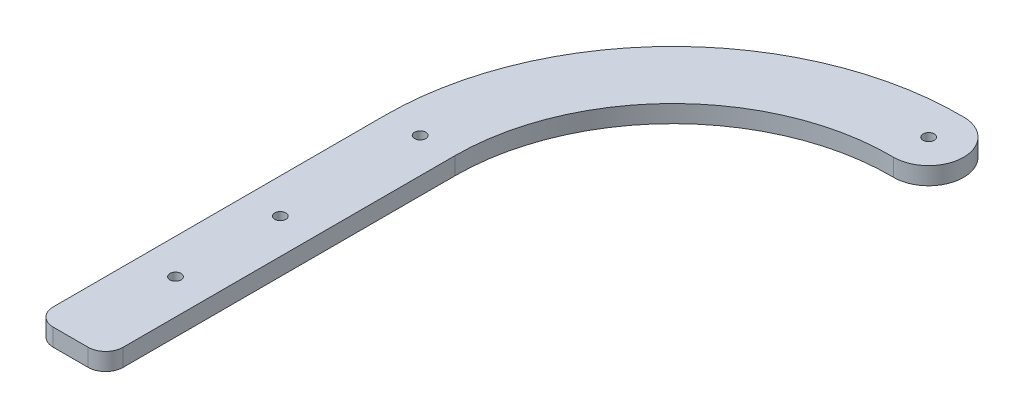
ISO-10303-21;
HEADER;
FILE_DESCRIPTION(('STEP AP214'),'2;1');
FILE_NAME('part.step','',(''),(''),'','','');
FILE_SCHEMA(('AUTOMOTIVE_DESIGN { 1 0 10303 214 1 1 1 1 }'));
ENDSEC;
DATA;
#1=APPLICATION_CONTEXT('core data for automotive mechanical design processes');
#2=APPLICATION_PROTOCOL_DEFINITION('international standard','automotive_design',2000,#1);
#3=PRODUCT_CONTEXT('',#1,'mechanical');
#4=PRODUCT('Part','Part','',(#3));
#5=PRODUCT_RELATED_PRODUCT_CATEGORY('part','',(#4));
#6=PRODUCT_DEFINITION_FORMATION('','',#4);
#7=PRODUCT_DEFINITION_CONTEXT('part definition',#1,'design');
#8=PRODUCT_DEFINITION('design','',#6,#7);
#9=PRODUCT_DEFINITION_SHAPE('','',#8);
#10=(LENGTH_UNIT() NAMED_UNIT(*) SI_UNIT(.MILLI.,.METRE.));
#11=(NAMED_UNIT(*) PLANE_ANGLE_UNIT() SI_UNIT($,.RADIAN.));
#12=(NAMED_UNIT(*) SI_UNIT($,.STERADIAN.) SOLID_ANGLE_UNIT());
#13=UNCERTAINTY_MEASURE_WITH_UNIT(LENGTH_MEASURE(1.E-05),#10,'distance_accuracy_value','');
#14=(GEOMETRIC_REPRESENTATION_CONTEXT(3) GLOBAL_UNCERTAINTY_ASSIGNED_CONTEXT((#13)) GLOBAL_UNIT_ASSIGNED_CONTEXT((#10,
#11,#12)) REPRESENTATION_CONTEXT('',''));
#15=CARTESIAN_POINT('',(0.,0.,0.));
#16=DIRECTION('',(0.,0.,1.));
#17=DIRECTION('',(1.,0.,0.));
#18=AXIS2_PLACEMENT_3D('',#15,#16,#17);
#19=CARTESIAN_POINT('',(82.3373430789616,5.,-100.));
#20=DIRECTION('',(0.,-1.,0.));
#21=DIRECTION('',(0.,0.,-1.));
#22=AXIS2_PLACEMENT_3D('',#19,#20,#21);
#23=CYLINDRICAL_SURFACE('',#22,82.3373430789616);
#24=CARTESIAN_POINT('',(82.3373430789616,0.,-100.));
#25=DIRECTION('',(0.,1.,0.));
#26=DIRECTION('',(0.,0.,-1.));
#27=AXIS2_PLACEMENT_3D('',#24,#25,#26);
#28=CIRCLE('',#27,82.3373430789616);
#29=CARTESIAN_POINT('',(83.2933897880461,0.,-182.33179240119));
#30=VERTEX_POINT('',#29);
#31=CARTESIAN_POINT('',(0.,0.,-100.));
#32=VERTEX_POINT('',#31);
#33=EDGE_CURVE('E116',#30,#32,#28,.T.);
#34=ORIENTED_EDGE('',*,*,#33,.T.);
#35=DIRECTION('',(0.,-1.,0.));
#36=VECTOR('',#35,1.);
#37=CARTESIAN_POINT('',(0.,5.,-100.));
#38=LINE('',#37,#36);
#39=CARTESIAN_POINT('',(0.,5.,-100.));
#40=VERTEX_POINT('',#39);
#41=EDGE_CURVE('E99',#40,#32,#38,.T.);
#42=ORIENTED_EDGE('',*,*,#41,.F.);
#43=CARTESIAN_POINT('',(82.3373430789616,5.,-100.));
#44=DIRECTION('',(0.,1.,0.));
#45=DIRECTION('',(0.,0.,-1.));
#46=AXIS2_PLACEMENT_3D('',#43,#44,#45);
#47=CIRCLE('',#46,82.3373430789616);
#48=CARTESIAN_POINT('',(83.2933897880461,5.,-182.33179240119));
#49=VERTEX_POINT('',#48);
#50=EDGE_CURVE('E104',#49,#40,#47,.T.);
#51=ORIENTED_EDGE('',*,*,#50,.F.);
#52=DIRECTION('',(0.,-1.,0.));
#53=VECTOR('',#52,1.);
#54=CARTESIAN_POINT('',(83.2933897880461,5.,-182.33179240119));
#55=LINE('',#54,#53);
#56=EDGE_CURVE('E166',#49,#30,#55,.T.);
#57=ORIENTED_EDGE('',*,*,#56,.T.);
#58=EDGE_LOOP('',(#34,#42,#51,#57));
#59=FACE_BOUND('',#58,.T.);
#60=ADVANCED_FACE('F31',(#59),#23,.T.);
#61=CARTESIAN_POINT('',(0.,5.,-50.));
#62=DIRECTION('',(1.,0.,0.));
#63=DIRECTION('',(0.,0.,-1.));
#64=AXIS2_PLACEMENT_3D('',#61,#62,#63);
#65=PLANE('',#64);
#66=DIRECTION('',(0.,0.,1.));
#67=VECTOR('',#66,1.);
#68=CARTESIAN_POINT('',(0.,0.,-50.));
#69=LINE('',#68,#67);
#70=CARTESIAN_POINT('',(0.,0.,-5.));
#71=VERTEX_POINT('',#70);
#72=EDGE_CURVE('E157',#32,#71,#69,.T.);
#73=ORIENTED_EDGE('',*,*,#72,.T.);
#74=DIRECTION('',(0.,-1.,0.));
#75=VECTOR('',#74,1.);
#76=CARTESIAN_POINT('',(0.,5.,-5.));
#77=LINE('',#76,#75);
#78=CARTESIAN_POINT('',(0.,5.,-5.));
#79=VERTEX_POINT('',#78);
#80=EDGE_CURVE('E11',#71,#79,#77,.F.);
#81=ORIENTED_EDGE('',*,*,#80,.T.);
#82=DIRECTION('',(0.,0.,1.));
#83=VECTOR('',#82,1.);
#84=CARTESIAN_POINT('',(0.,5.,-50.));
#85=LINE('',#84,#83);
#86=EDGE_CURVE('E95',#40,#79,#85,.T.);
#87=ORIENTED_EDGE('',*,*,#86,.F.);
#88=ORIENTED_EDGE('',*,*,#41,.T.);
#89=EDGE_LOOP('',(#73,#81,#87,#88));
#90=FACE_BOUND('',#89,.T.);
#91=ADVANCED_FACE('F97',(#90),#65,.F.);
#92=CARTESIAN_POINT('',(0.,5.,0.));
#93=DIRECTION('',(0.,0.,-1.));
#94=DIRECTION('',(-1.,0.,0.));
#95=AXIS2_PLACEMENT_3D('',#92,#93,#94);
#96=PLANE('',#95);
#97=DIRECTION('',(1.,0.,0.));
#98=VECTOR('',#97,1.);
#99=CARTESIAN_POINT('',(0.,0.,0.));
#100=LINE('',#99,#98);
#101=CARTESIAN_POINT('',(5.,0.,0.));
#102=VERTEX_POINT('',#101);
#103=CARTESIAN_POINT('',(15.,0.,0.));
#104=VERTEX_POINT('',#103);
#105=EDGE_CURVE('E152',#102,#104,#100,.T.);
#106=ORIENTED_EDGE('',*,*,#105,.T.);
#107=DIRECTION('',(0.,-1.,0.));
#108=VECTOR('',#107,1.);
#109=CARTESIAN_POINT('',(15.,5.,0.));
#110=LINE('',#109,#108);
#111=CARTESIAN_POINT('',(15.,5.,0.));
#112=VERTEX_POINT('',#111);
#113=EDGE_CURVE('E52',#104,#112,#110,.F.);
#114=ORIENTED_EDGE('',*,*,#113,.T.);
#115=DIRECTION('',(1.,0.,0.));
#116=VECTOR('',#115,1.);
#117=CARTESIAN_POINT('',(0.,5.,0.));
#118=LINE('',#117,#116);
#119=CARTESIAN_POINT('',(5.,5.,0.));
#120=VERTEX_POINT('',#119);
#121=EDGE_CURVE('E103',#120,#112,#118,.T.);
#122=ORIENTED_EDGE('',*,*,#121,.F.);
#123=DIRECTION('',(0.,-1.,0.));
#124=VECTOR('',#123,1.);
#125=CARTESIAN_POINT('',(5.,5.,0.));
#126=LINE('',#125,#124);
#127=EDGE_CURVE('E131',#120,#102,#126,.T.);
#128=ORIENTED_EDGE('',*,*,#127,.T.);
#129=EDGE_LOOP('',(#106,#114,#122,#128));
#130=FACE_BOUND('',#129,.T.);
#131=ADVANCED_FACE('F155',(#130),#96,.F.);
#132=CARTESIAN_POINT('',(20.,5.,-100.));
#133=DIRECTION('',(-1.,0.,0.));
#134=DIRECTION('',(0.,0.,1.));
#135=AXIS2_PLACEMENT_3D('',#132,#133,#134);
#136=PLANE('',#135);
#137=DIRECTION('',(0.,0.,-1.));
#138=VECTOR('',#137,1.);
#139=CARTESIAN_POINT('',(20.,5.,0.));
#140=LINE('',#139,#138);
#141=CARTESIAN_POINT('',(20.,5.,-5.00000000000001));
#142=VERTEX_POINT('',#141);
#143=CARTESIAN_POINT('',(20.,5.,-100.));
#144=VERTEX_POINT('',#143);
#145=EDGE_CURVE('E138',#142,#144,#140,.T.);
#146=ORIENTED_EDGE('',*,*,#145,.F.);
#147=DIRECTION('',(0.,-1.,0.));
#148=VECTOR('',#147,1.);
#149=CARTESIAN_POINT('',(20.,5.,-5.));
#150=LINE('',#149,#148);
#151=CARTESIAN_POINT('',(20.,0.,-5.));
#152=VERTEX_POINT('',#151);
#153=EDGE_CURVE('E117',#142,#152,#150,.T.);
#154=ORIENTED_EDGE('',*,*,#153,.T.);
#155=DIRECTION('',(0.,0.,-1.));
#156=VECTOR('',#155,1.);
#157=CARTESIAN_POINT('',(20.,0.,-100.));
#158=LINE('',#157,#156);
#159=CARTESIAN_POINT('',(20.,0.,-100.));
#160=VERTEX_POINT('',#159);
#161=EDGE_CURVE('E154',#152,#160,#158,.T.);
#162=ORIENTED_EDGE('',*,*,#161,.T.);
#163=DIRECTION('',(0.,-1.,0.));
#164=VECTOR('',#163,1.);
#165=CARTESIAN_POINT('',(20.,5.,-100.));
#166=LINE('',#165,#164);
#167=EDGE_CURVE('E118',#144,#160,#166,.T.);
#168=ORIENTED_EDGE('',*,*,#167,.F.);
#169=EDGE_LOOP('',(#146,#154,#162,#168));
#170=FACE_BOUND('',#169,.T.);
#171=ADVANCED_FACE('F143',(#170),#136,.F.);
#172=CARTESIAN_POINT('',(82.3373430789616,5.,-100.));
#173=DIRECTION('',(0.,-1.,0.));
#174=DIRECTION('',(0.,0.,-1.));
#175=AXIS2_PLACEMENT_3D('',#172,#173,#174);
#176=CYLINDRICAL_SURFACE('',#175,62.3373430789616);
#177=CARTESIAN_POINT('',(82.3373430789616,0.,-100.));
#178=DIRECTION('',(0.,-1.,0.));
#179=DIRECTION('',(0.,0.,1.));
#180=AXIS2_PLACEMENT_3D('',#177,#178,#179);
#181=CIRCLE('',#180,62.3373430789616);
#182=CARTESIAN_POINT('',(83.0611630308218,0.,-162.333140678306));
#183=VERTEX_POINT('',#182);
#184=EDGE_CURVE('E159',#160,#183,#181,.T.);
#185=ORIENTED_EDGE('',*,*,#184,.T.);
#186=DIRECTION('',(0.,-1.,0.));
#187=VECTOR('',#186,1.);
#188=CARTESIAN_POINT('',(83.0611630308218,5.,-162.333140678306));
#189=LINE('',#188,#187);
#190=CARTESIAN_POINT('',(83.0611630308218,5.,-162.333140678306));
#191=VERTEX_POINT('',#190);
#192=EDGE_CURVE('E124',#191,#183,#189,.T.);
#193=ORIENTED_EDGE('',*,*,#192,.F.);
#194=CARTESIAN_POINT('',(82.3373430789616,5.,-100.));
#195=DIRECTION('',(0.,-1.,0.));
#196=DIRECTION('',(0.,0.,1.));
#197=AXIS2_PLACEMENT_3D('',#194,#195,#196);
#198=CIRCLE('',#197,62.3373430789616);
#199=EDGE_CURVE('E146',#144,#191,#198,.T.);
#200=ORIENTED_EDGE('',*,*,#199,.F.);
#201=ORIENTED_EDGE('',*,*,#167,.T.);
#202=EDGE_LOOP('',(#185,#193,#200,#201));
#203=FACE_BOUND('',#202,.T.);
#204=ADVANCED_FACE('F276',(#203),#176,.F.);
#205=CARTESIAN_POINT('',(83.1772764094339,5.,-172.332466539748));
#206=DIRECTION('',(0.,-1.,0.));
#207=DIRECTION('',(0.,0.,-1.));
#208=AXIS2_PLACEMENT_3D('',#205,#206,#207);
#209=CYLINDRICAL_SURFACE('',#208,9.99999999999999);
#210=CARTESIAN_POINT('',(83.1772764094339,0.,-172.332466539748));
#211=DIRECTION('',(0.,1.,0.));
#212=DIRECTION('',(0.,0.,-1.));
#213=AXIS2_PLACEMENT_3D('',#210,#211,#212);
#214=CIRCLE('',#213,9.99999999999999);
#215=EDGE_CURVE('E113',#183,#30,#214,.T.);
#216=ORIENTED_EDGE('',*,*,#215,.T.);
#217=ORIENTED_EDGE('',*,*,#56,.F.);
#218=CARTESIAN_POINT('',(83.1772764094339,5.,-172.332466539748));
#219=DIRECTION('',(0.,1.,0.));
#220=DIRECTION('',(0.,0.,-1.));
#221=AXIS2_PLACEMENT_3D('',#218,#219,#220);
#222=CIRCLE('',#221,9.99999999999999);
#223=EDGE_CURVE('E109',#191,#49,#222,.T.);
#224=ORIENTED_EDGE('',*,*,#223,.F.);
#225=ORIENTED_EDGE('',*,*,#192,.T.);
#226=EDGE_LOOP('',(#216,#217,#224,#225));
#227=FACE_BOUND('',#226,.T.);
#228=ADVANCED_FACE('F171',(#227),#209,.T.);
#229=CARTESIAN_POINT('',(82.3373430789616,5.,-100.));
#230=DIRECTION('',(0.,-1.,0.));
#231=DIRECTION('',(0.,0.,-1.));
#232=AXIS2_PLACEMENT_3D('',#229,#230,#231);
#233=PLANE('',#232);
#234=CARTESIAN_POINT('',(9.99999999999999,5.,-100.));
#235=DIRECTION('',(0.,1.,0.));
#236=DIRECTION('',(0.,0.,1.));
#237=AXIS2_PLACEMENT_3D('',#234,#235,#236);
#238=CIRCLE('',#237,1.6);
#239=CARTESIAN_POINT('',(9.99999999999999,5.,-98.4));
#240=VERTEX_POINT('',#239);
#241=EDGE_CURVE('E196',#240,#240,#238,.T.);
#242=ORIENTED_EDGE('',*,*,#241,.F.);
#243=EDGE_LOOP('',(#242));
#244=FACE_BOUND('',#243,.T.);
#245=CARTESIAN_POINT('',(83.1772764094339,5.,-172.332466539748));
#246=DIRECTION('',(0.,1.,0.));
#247=DIRECTION('',(0.,0.,1.));
#248=AXIS2_PLACEMENT_3D('',#245,#246,#247);
#249=CIRCLE('',#248,1.6);
#250=CARTESIAN_POINT('',(83.1772764094339,5.,-170.732466539748));
#251=VERTEX_POINT('',#250);
#252=EDGE_CURVE('E190',#251,#251,#249,.T.);
#253=ORIENTED_EDGE('',*,*,#252,.F.);
#254=EDGE_LOOP('',(#253));
#255=FACE_BOUND('',#254,.T.);
#256=CARTESIAN_POINT('',(10.,5.,-30.));
#257=DIRECTION('',(0.,1.,0.));
#258=DIRECTION('',(0.,0.,1.));
#259=AXIS2_PLACEMENT_3D('',#256,#257,#258);
#260=CIRCLE('',#259,1.6);
#261=CARTESIAN_POINT('',(10.,5.,-28.4));
#262=VERTEX_POINT('',#261);
#263=EDGE_CURVE('E184',#262,#262,#260,.T.);
#264=ORIENTED_EDGE('',*,*,#263,.F.);
#265=EDGE_LOOP('',(#264));
#266=FACE_BOUND('',#265,.T.);
#267=CARTESIAN_POINT('',(10.,5.,-60.));
#268=DIRECTION('',(0.,1.,0.));
#269=DIRECTION('',(0.,0.,1.));
#270=AXIS2_PLACEMENT_3D('',#267,#268,#269);
#271=CIRCLE('',#270,1.6);
#272=CARTESIAN_POINT('',(10.,5.,-58.4));
#273=VERTEX_POINT('',#272);
#274=EDGE_CURVE('E175',#273,#273,#271,.T.);
#275=ORIENTED_EDGE('',*,*,#274,.F.);
#276=EDGE_LOOP('',(#275));
#277=FACE_BOUND('',#276,.T.);
#278=ORIENTED_EDGE('',*,*,#121,.T.);
#279=CARTESIAN_POINT('',(15.,5.,-5.));
#280=DIRECTION('',(0.,-1.,0.));
#281=DIRECTION('',(0.,0.,-1.));
#282=AXIS2_PLACEMENT_3D('',#279,#280,#281);
#283=CIRCLE('',#282,5.);
#284=EDGE_CURVE('E39',#112,#142,#283,.F.);
#285=ORIENTED_EDGE('',*,*,#284,.T.);
#286=ORIENTED_EDGE('',*,*,#145,.T.);
#287=ORIENTED_EDGE('',*,*,#199,.T.);
#288=ORIENTED_EDGE('',*,*,#223,.T.);
#289=ORIENTED_EDGE('',*,*,#50,.T.);
#290=ORIENTED_EDGE('',*,*,#86,.T.);
#291=CARTESIAN_POINT('',(5.,5.,-5.));
#292=DIRECTION('',(0.,-1.,0.));
#293=DIRECTION('',(0.,0.,-1.));
#294=AXIS2_PLACEMENT_3D('',#291,#292,#293);
#295=CIRCLE('',#294,5.);
#296=EDGE_CURVE('E135',#79,#120,#295,.F.);
#297=ORIENTED_EDGE('',*,*,#296,.T.);
#298=EDGE_LOOP('',(#278,#285,#286,#287,#288,#289,#290,#297));
#299=FACE_BOUND('',#298,.T.);
#300=ADVANCED_FACE('F107',(#244,#255,#266,#277,#299),#233,.F.);
#301=CARTESIAN_POINT('',(82.3373430789616,0.,-100.));
#302=DIRECTION('',(0.,-1.,0.));
#303=DIRECTION('',(0.,0.,-1.));
#304=AXIS2_PLACEMENT_3D('',#301,#302,#303);
#305=PLANE('',#304);
#306=CARTESIAN_POINT('',(9.99999999999999,0.,-100.));
#307=DIRECTION('',(0.,1.,0.));
#308=DIRECTION('',(0.,0.,1.));
#309=AXIS2_PLACEMENT_3D('',#306,#307,#308);
#310=CIRCLE('',#309,1.6);
#311=CARTESIAN_POINT('',(9.99999999999999,0.,-98.4));
#312=VERTEX_POINT('',#311);
#313=EDGE_CURVE('E193',#312,#312,#310,.T.);
#314=ORIENTED_EDGE('',*,*,#313,.T.);
#315=EDGE_LOOP('',(#314));
#316=FACE_BOUND('',#315,.T.);
#317=CARTESIAN_POINT('',(83.1772764094339,0.,-172.332466539748));
#318=DIRECTION('',(0.,1.,0.));
#319=DIRECTION('',(0.,0.,1.));
#320=AXIS2_PLACEMENT_3D('',#317,#318,#319);
#321=CIRCLE('',#320,1.6);
#322=CARTESIAN_POINT('',(83.1772764094339,0.,-170.732466539748));
#323=VERTEX_POINT('',#322);
#324=EDGE_CURVE('E187',#323,#323,#321,.T.);
#325=ORIENTED_EDGE('',*,*,#324,.T.);
#326=EDGE_LOOP('',(#325));
#327=FACE_BOUND('',#326,.T.);
#328=CARTESIAN_POINT('',(10.,0.,-30.));
#329=DIRECTION('',(0.,1.,0.));
#330=DIRECTION('',(0.,0.,1.));
#331=AXIS2_PLACEMENT_3D('',#328,#329,#330);
#332=CIRCLE('',#331,1.6);
#333=CARTESIAN_POINT('',(10.,0.,-28.4));
#334=VERTEX_POINT('',#333);
#335=EDGE_CURVE('E182',#334,#334,#332,.T.);
#336=ORIENTED_EDGE('',*,*,#335,.T.);
#337=EDGE_LOOP('',(#336));
#338=FACE_BOUND('',#337,.T.);
#339=CARTESIAN_POINT('',(10.,0.,-60.));
#340=DIRECTION('',(0.,1.,0.));
#341=DIRECTION('',(0.,0.,1.));
#342=AXIS2_PLACEMENT_3D('',#339,#340,#341);
#343=CIRCLE('',#342,1.6);
#344=CARTESIAN_POINT('',(10.,0.,-58.4));
#345=VERTEX_POINT('',#344);
#346=EDGE_CURVE('E173',#345,#345,#343,.T.);
#347=ORIENTED_EDGE('',*,*,#346,.T.);
#348=EDGE_LOOP('',(#347));
#349=FACE_BOUND('',#348,.T.);
#350=ORIENTED_EDGE('',*,*,#161,.F.);
#351=CARTESIAN_POINT('',(15.,0.,-5.));
#352=DIRECTION('',(0.,-1.,0.));
#353=DIRECTION('',(0.,0.,-1.));
#354=AXIS2_PLACEMENT_3D('',#351,#352,#353);
#355=CIRCLE('',#354,5.);
#356=EDGE_CURVE('E129',#152,#104,#355,.T.);
#357=ORIENTED_EDGE('',*,*,#356,.T.);
#358=ORIENTED_EDGE('',*,*,#105,.F.);
#359=CARTESIAN_POINT('',(5.,0.,-5.));
#360=DIRECTION('',(0.,-1.,0.));
#361=DIRECTION('',(0.,0.,-1.));
#362=AXIS2_PLACEMENT_3D('',#359,#360,#361);
#363=CIRCLE('',#362,5.);
#364=EDGE_CURVE('E121',#102,#71,#363,.T.);
#365=ORIENTED_EDGE('',*,*,#364,.T.);
#366=ORIENTED_EDGE('',*,*,#72,.F.);
#367=ORIENTED_EDGE('',*,*,#33,.F.);
#368=ORIENTED_EDGE('',*,*,#215,.F.);
#369=ORIENTED_EDGE('',*,*,#184,.F.);
#370=EDGE_LOOP('',(#350,#357,#358,#365,#366,#367,#368,#369));
#371=FACE_BOUND('',#370,.T.);
#372=ADVANCED_FACE('F151',(#316,#327,#338,#349,#371),#305,.T.);
#373=CARTESIAN_POINT('',(10.,0.,-60.));
#374=DIRECTION('',(0.,1.,0.));
#375=DIRECTION('',(0.,0.,1.));
#376=AXIS2_PLACEMENT_3D('',#373,#374,#375);
#377=CYLINDRICAL_SURFACE('',#376,1.6);
#378=ORIENTED_EDGE('',*,*,#346,.F.);
#379=EDGE_LOOP('',(#378));
#380=FACE_BOUND('',#379,.T.);
#381=ORIENTED_EDGE('',*,*,#274,.T.);
#382=EDGE_LOOP('',(#381));
#383=FACE_BOUND('',#382,.T.);
#384=ADVANCED_FACE('F220',(#380,#383),#377,.F.);
#385=CARTESIAN_POINT('',(10.,0.,-30.));
#386=DIRECTION('',(0.,1.,0.));
#387=DIRECTION('',(0.,0.,1.));
#388=AXIS2_PLACEMENT_3D('',#385,#386,#387);
#389=CYLINDRICAL_SURFACE('',#388,1.6);
#390=ORIENTED_EDGE('',*,*,#335,.F.);
#391=EDGE_LOOP('',(#390));
#392=FACE_BOUND('',#391,.T.);
#393=ORIENTED_EDGE('',*,*,#263,.T.);
#394=EDGE_LOOP('',(#393));
#395=FACE_BOUND('',#394,.T.);
#396=ADVANCED_FACE('F222',(#392,#395),#389,.F.);
#397=CARTESIAN_POINT('',(83.1772764094339,0.,-172.332466539748));
#398=DIRECTION('',(0.,1.,0.));
#399=DIRECTION('',(0.,0.,1.));
#400=AXIS2_PLACEMENT_3D('',#397,#398,#399);
#401=CYLINDRICAL_SURFACE('',#400,1.6);
#402=ORIENTED_EDGE('',*,*,#324,.F.);
#403=EDGE_LOOP('',(#402));
#404=FACE_BOUND('',#403,.T.);
#405=ORIENTED_EDGE('',*,*,#252,.T.);
#406=EDGE_LOOP('',(#405));
#407=FACE_BOUND('',#406,.T.);
#408=ADVANCED_FACE('F207',(#404,#407),#401,.F.);
#409=CARTESIAN_POINT('',(9.99999999999999,0.,-100.));
#410=DIRECTION('',(0.,1.,0.));
#411=DIRECTION('',(0.,0.,1.));
#412=AXIS2_PLACEMENT_3D('',#409,#410,#411);
#413=CYLINDRICAL_SURFACE('',#412,1.6);
#414=ORIENTED_EDGE('',*,*,#313,.F.);
#415=EDGE_LOOP('',(#414));
#416=FACE_BOUND('',#415,.T.);
#417=ORIENTED_EDGE('',*,*,#241,.T.);
#418=EDGE_LOOP('',(#417));
#419=FACE_BOUND('',#418,.T.);
#420=ADVANCED_FACE('F204',(#416,#419),#413,.F.);
#421=CARTESIAN_POINT('',(15.,5.,-5.));
#422=DIRECTION('',(0.,-1.,0.));
#423=DIRECTION('',(0.,0.,-1.));
#424=AXIS2_PLACEMENT_3D('',#421,#422,#423);
#425=CYLINDRICAL_SURFACE('',#424,5.);
#426=ORIENTED_EDGE('',*,*,#284,.F.);
#427=ORIENTED_EDGE('',*,*,#113,.F.);
#428=ORIENTED_EDGE('',*,*,#356,.F.);
#429=ORIENTED_EDGE('',*,*,#153,.F.);
#430=EDGE_LOOP('',(#426,#427,#428,#429));
#431=FACE_BOUND('',#430,.T.);
#432=ADVANCED_FACE('F148',(#431),#425,.T.);
#433=CARTESIAN_POINT('',(5.,5.,-5.));
#434=DIRECTION('',(0.,-1.,0.));
#435=DIRECTION('',(0.,0.,-1.));
#436=AXIS2_PLACEMENT_3D('',#433,#434,#435);
#437=CYLINDRICAL_SURFACE('',#436,5.);
#438=ORIENTED_EDGE('',*,*,#296,.F.);
#439=ORIENTED_EDGE('',*,*,#80,.F.);
#440=ORIENTED_EDGE('',*,*,#364,.F.);
#441=ORIENTED_EDGE('',*,*,#127,.F.);
#442=EDGE_LOOP('',(#438,#439,#440,#441));
#443=FACE_BOUND('',#442,.T.);
#444=ADVANCED_FACE('F33',(#443),#437,.T.);
#445=CLOSED_SHELL('',(#60,#91,#131,#171,#204,#228,#300,#372,#384,#396,#408,#420,#432,#444));
#446=MANIFOLD_SOLID_BREP('B2',#445);
#447=ADVANCED_BREP_SHAPE_REPRESENTATION('',(#18,#446),#14);
#448=SHAPE_DEFINITION_REPRESENTATION(#9,#447);
ENDSEC;
END-ISO-10303-21;
